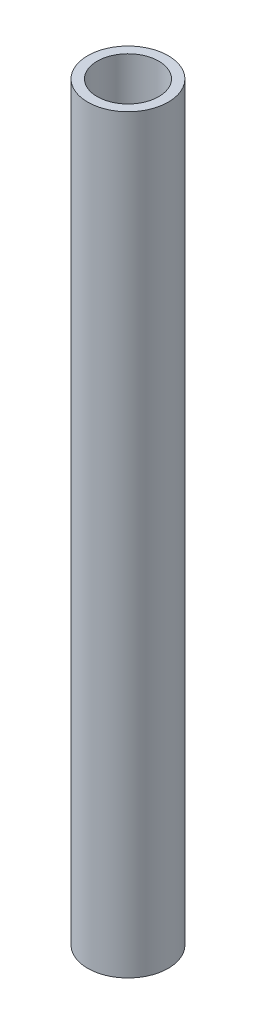
ISO-10303-21;
HEADER;
FILE_DESCRIPTION(('STEP AP214'),'2;1');
FILE_NAME('part.step','',(''),(''),'','','');
FILE_SCHEMA(('AUTOMOTIVE_DESIGN { 1 0 10303 214 1 1 1 1 }'));
ENDSEC;
DATA;
#1=APPLICATION_CONTEXT('core data for automotive mechanical design processes');
#2=APPLICATION_PROTOCOL_DEFINITION('international standard','automotive_design',2000,#1);
#3=PRODUCT_CONTEXT('',#1,'mechanical');
#4=PRODUCT('Part','Part','',(#3));
#5=PRODUCT_RELATED_PRODUCT_CATEGORY('part','',(#4));
#6=PRODUCT_DEFINITION_FORMATION('','',#4);
#7=PRODUCT_DEFINITION_CONTEXT('part definition',#1,'design');
#8=PRODUCT_DEFINITION('design','',#6,#7);
#9=PRODUCT_DEFINITION_SHAPE('','',#8);
#10=(LENGTH_UNIT() NAMED_UNIT(*) SI_UNIT(.MILLI.,.METRE.));
#11=(NAMED_UNIT(*) PLANE_ANGLE_UNIT() SI_UNIT($,.RADIAN.));
#12=(NAMED_UNIT(*) SI_UNIT($,.STERADIAN.) SOLID_ANGLE_UNIT());
#13=UNCERTAINTY_MEASURE_WITH_UNIT(LENGTH_MEASURE(1.E-05),#10,'distance_accuracy_value','');
#14=(GEOMETRIC_REPRESENTATION_CONTEXT(3) GLOBAL_UNCERTAINTY_ASSIGNED_CONTEXT((#13)) GLOBAL_UNIT_ASSIGNED_CONTEXT((#10,
#11,#12)) REPRESENTATION_CONTEXT('',''));
#15=CARTESIAN_POINT('',(0.,0.,0.));
#16=DIRECTION('',(0.,0.,1.));
#17=DIRECTION('',(1.,0.,0.));
#18=AXIS2_PLACEMENT_3D('',#15,#16,#17);
#19=CARTESIAN_POINT('',(0.,-12.065,0.));
#20=DIRECTION('',(0.,1.,0.));
#21=DIRECTION('',(0.,0.,1.));
#22=AXIS2_PLACEMENT_3D('',#19,#20,#21);
#23=CYLINDRICAL_SURFACE('',#22,0.6477);
#24=CARTESIAN_POINT('',(0.,-12.065,0.));
#25=DIRECTION('',(0.,1.,0.));
#26=DIRECTION('',(0.,0.,1.));
#27=AXIS2_PLACEMENT_3D('',#24,#25,#26);
#28=CIRCLE('',#27,0.6477);
#29=CARTESIAN_POINT('',(0.,-12.065,0.6477));
#30=VERTEX_POINT('',#29);
#31=EDGE_CURVE('E10',#30,#30,#28,.T.);
#32=ORIENTED_EDGE('',*,*,#31,.T.);
#33=EDGE_LOOP('',(#32));
#34=FACE_BOUND('',#33,.T.);
#35=CARTESIAN_POINT('',(0.,0.,0.));
#36=DIRECTION('',(0.,1.,0.));
#37=DIRECTION('',(0.,0.,1.));
#38=AXIS2_PLACEMENT_3D('',#35,#36,#37);
#39=CIRCLE('',#38,0.6477);
#40=CARTESIAN_POINT('',(0.,0.,0.6477));
#41=VERTEX_POINT('',#40);
#42=EDGE_CURVE('E34',#41,#41,#39,.T.);
#43=ORIENTED_EDGE('',*,*,#42,.F.);
#44=EDGE_LOOP('',(#43));
#45=FACE_BOUND('',#44,.T.);
#46=ADVANCED_FACE('F31',(#34,#45),#23,.T.);
#47=CARTESIAN_POINT('',(0.,-12.065,0.));
#48=DIRECTION('',(0.,1.,0.));
#49=DIRECTION('',(0.,0.,1.));
#50=AXIS2_PLACEMENT_3D('',#47,#48,#49);
#51=PLANE('',#50);
#52=CARTESIAN_POINT('',(0.,-12.065,0.));
#53=DIRECTION('',(0.,1.,0.));
#54=DIRECTION('',(0.,0.,1.));
#55=AXIS2_PLACEMENT_3D('',#52,#53,#54);
#56=CIRCLE('',#55,0.4953);
#57=CARTESIAN_POINT('',(0.,-12.065,0.4953));
#58=VERTEX_POINT('',#57);
#59=EDGE_CURVE('E41',#58,#58,#56,.T.);
#60=ORIENTED_EDGE('',*,*,#59,.T.);
#61=EDGE_LOOP('',(#60));
#62=FACE_BOUND('',#61,.T.);
#63=ORIENTED_EDGE('',*,*,#31,.F.);
#64=EDGE_LOOP('',(#63));
#65=FACE_BOUND('',#64,.T.);
#66=ADVANCED_FACE('F49',(#62,#65),#51,.F.);
#67=CARTESIAN_POINT('',(0.,0.,0.));
#68=DIRECTION('',(0.,1.,0.));
#69=DIRECTION('',(0.,0.,1.));
#70=AXIS2_PLACEMENT_3D('',#67,#68,#69);
#71=PLANE('',#70);
#72=CARTESIAN_POINT('',(0.,0.,0.));
#73=DIRECTION('',(0.,1.,0.));
#74=DIRECTION('',(0.,0.,1.));
#75=AXIS2_PLACEMENT_3D('',#72,#73,#74);
#76=CIRCLE('',#75,0.4953);
#77=CARTESIAN_POINT('',(0.,0.,0.4953));
#78=VERTEX_POINT('',#77);
#79=EDGE_CURVE('E43',#78,#78,#76,.T.);
#80=ORIENTED_EDGE('',*,*,#79,.F.);
#81=EDGE_LOOP('',(#80));
#82=FACE_BOUND('',#81,.T.);
#83=ORIENTED_EDGE('',*,*,#42,.T.);
#84=EDGE_LOOP('',(#83));
#85=FACE_BOUND('',#84,.T.);
#86=ADVANCED_FACE('F55',(#82,#85),#71,.T.);
#87=CARTESIAN_POINT('',(0.,-12.065,0.));
#88=DIRECTION('',(0.,1.,0.));
#89=DIRECTION('',(0.,0.,1.));
#90=AXIS2_PLACEMENT_3D('',#87,#88,#89);
#91=CYLINDRICAL_SURFACE('',#90,0.4953);
#92=ORIENTED_EDGE('',*,*,#59,.F.);
#93=EDGE_LOOP('',(#92));
#94=FACE_BOUND('',#93,.T.);
#95=ORIENTED_EDGE('',*,*,#79,.T.);
#96=EDGE_LOOP('',(#95));
#97=FACE_BOUND('',#96,.T.);
#98=ADVANCED_FACE('F52',(#94,#97),#91,.F.);
#99=CLOSED_SHELL('',(#46,#66,#86,#98));
#100=MANIFOLD_SOLID_BREP('B2',#99);
#101=ADVANCED_BREP_SHAPE_REPRESENTATION('',(#18,#100),#14);
#102=SHAPE_DEFINITION_REPRESENTATION(#9,#101);
ENDSEC;
END-ISO-10303-21;
